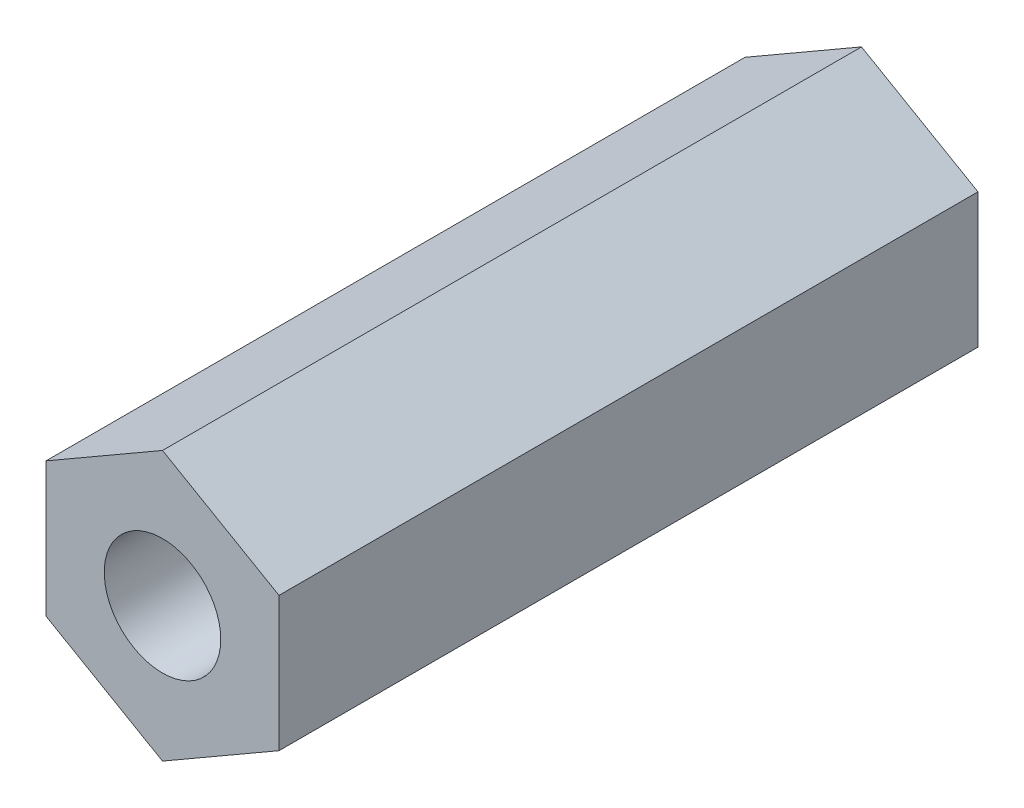
ISO-10303-21;
HEADER;
FILE_DESCRIPTION(('STEP AP214'),'2;1');
FILE_NAME('part.step','',(''),(''),'','','');
FILE_SCHEMA(('AUTOMOTIVE_DESIGN { 1 0 10303 214 1 1 1 1 }'));
ENDSEC;
DATA;
#1=APPLICATION_CONTEXT('core data for automotive mechanical design processes');
#2=APPLICATION_PROTOCOL_DEFINITION('international standard','automotive_design',2000,#1);
#3=PRODUCT_CONTEXT('',#1,'mechanical');
#4=PRODUCT('Part','Part','',(#3));
#5=PRODUCT_RELATED_PRODUCT_CATEGORY('part','',(#4));
#6=PRODUCT_DEFINITION_FORMATION('','',#4);
#7=PRODUCT_DEFINITION_CONTEXT('part definition',#1,'design');
#8=PRODUCT_DEFINITION('design','',#6,#7);
#9=PRODUCT_DEFINITION_SHAPE('','',#8);
#10=(LENGTH_UNIT() NAMED_UNIT(*) SI_UNIT(.MILLI.,.METRE.));
#11=(NAMED_UNIT(*) PLANE_ANGLE_UNIT() SI_UNIT($,.RADIAN.));
#12=(NAMED_UNIT(*) SI_UNIT($,.STERADIAN.) SOLID_ANGLE_UNIT());
#13=UNCERTAINTY_MEASURE_WITH_UNIT(LENGTH_MEASURE(1.E-05),#10,'distance_accuracy_value','');
#14=(GEOMETRIC_REPRESENTATION_CONTEXT(3) GLOBAL_UNCERTAINTY_ASSIGNED_CONTEXT((#13)) GLOBAL_UNIT_ASSIGNED_CONTEXT((#10,
#11,#12)) REPRESENTATION_CONTEXT('',''));
#15=CARTESIAN_POINT('',(0.,0.,0.));
#16=DIRECTION('',(0.,0.,1.));
#17=DIRECTION('',(1.,0.,0.));
#18=AXIS2_PLACEMENT_3D('',#15,#16,#17);
#19=CARTESIAN_POINT('',(0.,3.46410161513775,9.));
#20=DIRECTION('',(0.,0.,1.));
#21=DIRECTION('',(1.,0.,0.));
#22=AXIS2_PLACEMENT_3D('',#19,#20,#21);
#23=PLANE('',#22);
#24=DIRECTION('',(-0.866025403784439,0.499999999999999,0.));
#25=VECTOR('',#24,1.);
#26=CARTESIAN_POINT('',(3.,1.73205080756888,9.));
#27=LINE('',#26,#25);
#28=CARTESIAN_POINT('',(3.,1.73205080756888,9.));
#29=VERTEX_POINT('',#28);
#30=CARTESIAN_POINT('',(0.,3.46410161513775,9.));
#31=VERTEX_POINT('',#30);
#32=EDGE_CURVE('E125',#29,#31,#27,.T.);
#33=ORIENTED_EDGE('',*,*,#32,.T.);
#34=DIRECTION('',(-0.866025403784439,-0.5,0.));
#35=VECTOR('',#34,1.);
#36=CARTESIAN_POINT('',(0.,3.46410161513775,9.));
#37=LINE('',#36,#35);
#38=CARTESIAN_POINT('',(-3.,1.73205080756888,9.));
#39=VERTEX_POINT('',#38);
#40=EDGE_CURVE('E92',#31,#39,#37,.T.);
#41=ORIENTED_EDGE('',*,*,#40,.T.);
#42=DIRECTION('',(0.,-1.,0.));
#43=VECTOR('',#42,1.);
#44=CARTESIAN_POINT('',(-3.,1.73205080756888,9.));
#45=LINE('',#44,#43);
#46=CARTESIAN_POINT('',(-3.,-1.73205080756888,9.));
#47=VERTEX_POINT('',#46);
#48=EDGE_CURVE('E128',#39,#47,#45,.T.);
#49=ORIENTED_EDGE('',*,*,#48,.T.);
#50=DIRECTION('',(0.866025403784439,-0.499999999999999,0.));
#51=VECTOR('',#50,1.);
#52=CARTESIAN_POINT('',(-3.,-1.73205080756888,9.));
#53=LINE('',#52,#51);
#54=CARTESIAN_POINT('',(0.,-3.46410161513775,9.));
#55=VERTEX_POINT('',#54);
#56=EDGE_CURVE('E130',#47,#55,#53,.T.);
#57=ORIENTED_EDGE('',*,*,#56,.T.);
#58=DIRECTION('',(0.866025403784438,0.5,0.));
#59=VECTOR('',#58,1.);
#60=CARTESIAN_POINT('',(0.,-3.46410161513775,9.));
#61=LINE('',#60,#59);
#62=CARTESIAN_POINT('',(3.,-1.73205080756888,9.));
#63=VERTEX_POINT('',#62);
#64=EDGE_CURVE('E56',#55,#63,#61,.T.);
#65=ORIENTED_EDGE('',*,*,#64,.T.);
#66=DIRECTION('',(0.,1.,0.));
#67=VECTOR('',#66,1.);
#68=CARTESIAN_POINT('',(3.,-1.73205080756888,9.));
#69=LINE('',#68,#67);
#70=EDGE_CURVE('E51',#63,#29,#69,.T.);
#71=ORIENTED_EDGE('',*,*,#70,.T.);
#72=EDGE_LOOP('',(#33,#41,#49,#57,#65,#71));
#73=FACE_BOUND('',#72,.T.);
#74=CARTESIAN_POINT('',(0.,0.,9.));
#75=DIRECTION('',(0.,0.,1.));
#76=DIRECTION('',(1.,0.,0.));
#77=AXIS2_PLACEMENT_3D('',#74,#75,#76);
#78=CIRCLE('',#77,1.5);
#79=CARTESIAN_POINT('',(1.5,0.,9.));
#80=VERTEX_POINT('',#79);
#81=EDGE_CURVE('E122',#80,#80,#78,.T.);
#82=ORIENTED_EDGE('',*,*,#81,.F.);
#83=EDGE_LOOP('',(#82));
#84=FACE_BOUND('',#83,.T.);
#85=ADVANCED_FACE('F36',(#73,#84),#23,.T.);
#86=CARTESIAN_POINT('',(3.,1.73205080756888,9.));
#87=DIRECTION('',(-0.499999999999999,-0.866025403784439,0.));
#88=DIRECTION('',(0.866025403784439,-0.499999999999999,0.));
#89=AXIS2_PLACEMENT_3D('',#86,#87,#88);
#90=PLANE('',#89);
#91=DIRECTION('',(0.,0.,-1.));
#92=VECTOR('',#91,1.);
#93=CARTESIAN_POINT('',(3.,1.73205080756888,9.));
#94=LINE('',#93,#92);
#95=CARTESIAN_POINT('',(3.,1.73205080756888,-9.));
#96=VERTEX_POINT('',#95);
#97=EDGE_CURVE('E107',#29,#96,#94,.T.);
#98=ORIENTED_EDGE('',*,*,#97,.T.);
#99=DIRECTION('',(-0.866025403784439,0.499999999999999,0.));
#100=VECTOR('',#99,1.);
#101=CARTESIAN_POINT('',(3.,1.73205080756888,-9.));
#102=LINE('',#101,#100);
#103=CARTESIAN_POINT('',(0.,3.46410161513775,-9.));
#104=VERTEX_POINT('',#103);
#105=EDGE_CURVE('E101',#96,#104,#102,.T.);
#106=ORIENTED_EDGE('',*,*,#105,.T.);
#107=DIRECTION('',(0.,0.,-1.));
#108=VECTOR('',#107,1.);
#109=CARTESIAN_POINT('',(0.,3.46410161513775,9.));
#110=LINE('',#109,#108);
#111=EDGE_CURVE('E11',#31,#104,#110,.T.);
#112=ORIENTED_EDGE('',*,*,#111,.F.);
#113=ORIENTED_EDGE('',*,*,#32,.F.);
#114=EDGE_LOOP('',(#98,#106,#112,#113));
#115=FACE_BOUND('',#114,.T.);
#116=ADVANCED_FACE('F38',(#115),#90,.F.);
#117=CARTESIAN_POINT('',(0.,3.46410161513775,9.));
#118=DIRECTION('',(0.5,-0.866025403784438,0.));
#119=DIRECTION('',(0.866025403784439,0.5,0.));
#120=AXIS2_PLACEMENT_3D('',#117,#118,#119);
#121=PLANE('',#120);
#122=ORIENTED_EDGE('',*,*,#111,.T.);
#123=DIRECTION('',(-0.866025403784439,-0.5,0.));
#124=VECTOR('',#123,1.);
#125=CARTESIAN_POINT('',(0.,3.46410161513775,-9.));
#126=LINE('',#125,#124);
#127=CARTESIAN_POINT('',(-3.,1.73205080756888,-9.));
#128=VERTEX_POINT('',#127);
#129=EDGE_CURVE('E91',#104,#128,#126,.T.);
#130=ORIENTED_EDGE('',*,*,#129,.T.);
#131=DIRECTION('',(0.,0.,-1.));
#132=VECTOR('',#131,1.);
#133=CARTESIAN_POINT('',(-3.,1.73205080756888,9.));
#134=LINE('',#133,#132);
#135=EDGE_CURVE('E44',#39,#128,#134,.T.);
#136=ORIENTED_EDGE('',*,*,#135,.F.);
#137=ORIENTED_EDGE('',*,*,#40,.F.);
#138=EDGE_LOOP('',(#122,#130,#136,#137));
#139=FACE_BOUND('',#138,.T.);
#140=ADVANCED_FACE('F89',(#139),#121,.F.);
#141=CARTESIAN_POINT('',(-3.,1.73205080756888,9.));
#142=DIRECTION('',(1.,0.,0.));
#143=DIRECTION('',(0.,0.,-1.));
#144=AXIS2_PLACEMENT_3D('',#141,#142,#143);
#145=PLANE('',#144);
#146=ORIENTED_EDGE('',*,*,#135,.T.);
#147=DIRECTION('',(0.,-1.,0.));
#148=VECTOR('',#147,1.);
#149=CARTESIAN_POINT('',(-3.,1.73205080756888,-9.));
#150=LINE('',#149,#148);
#151=CARTESIAN_POINT('',(-3.,-1.73205080756888,-9.));
#152=VERTEX_POINT('',#151);
#153=EDGE_CURVE('E105',#128,#152,#150,.T.);
#154=ORIENTED_EDGE('',*,*,#153,.T.);
#155=DIRECTION('',(0.,0.,-1.));
#156=VECTOR('',#155,1.);
#157=CARTESIAN_POINT('',(-3.,-1.73205080756888,9.));
#158=LINE('',#157,#156);
#159=EDGE_CURVE('E139',#47,#152,#158,.T.);
#160=ORIENTED_EDGE('',*,*,#159,.F.);
#161=ORIENTED_EDGE('',*,*,#48,.F.);
#162=EDGE_LOOP('',(#146,#154,#160,#161));
#163=FACE_BOUND('',#162,.T.);
#164=ADVANCED_FACE('F142',(#163),#145,.F.);
#165=CARTESIAN_POINT('',(-3.,-1.73205080756888,9.));
#166=DIRECTION('',(0.499999999999999,0.866025403784439,0.));
#167=DIRECTION('',(-0.866025403784439,0.5,0.));
#168=AXIS2_PLACEMENT_3D('',#165,#166,#167);
#169=PLANE('',#168);
#170=ORIENTED_EDGE('',*,*,#159,.T.);
#171=DIRECTION('',(0.866025403784439,-0.499999999999999,0.));
#172=VECTOR('',#171,1.);
#173=CARTESIAN_POINT('',(-3.,-1.73205080756888,-9.));
#174=LINE('',#173,#172);
#175=CARTESIAN_POINT('',(0.,-3.46410161513775,-9.));
#176=VERTEX_POINT('',#175);
#177=EDGE_CURVE('E114',#152,#176,#174,.T.);
#178=ORIENTED_EDGE('',*,*,#177,.T.);
#179=DIRECTION('',(0.,0.,-1.));
#180=VECTOR('',#179,1.);
#181=CARTESIAN_POINT('',(0.,-3.46410161513775,9.));
#182=LINE('',#181,#180);
#183=EDGE_CURVE('E137',#55,#176,#182,.T.);
#184=ORIENTED_EDGE('',*,*,#183,.F.);
#185=ORIENTED_EDGE('',*,*,#56,.F.);
#186=EDGE_LOOP('',(#170,#178,#184,#185));
#187=FACE_BOUND('',#186,.T.);
#188=ADVANCED_FACE('F148',(#187),#169,.F.);
#189=CARTESIAN_POINT('',(0.,-3.46410161513775,9.));
#190=DIRECTION('',(-0.5,0.866025403784438,0.));
#191=DIRECTION('',(-0.866025403784439,-0.5,0.));
#192=AXIS2_PLACEMENT_3D('',#189,#190,#191);
#193=PLANE('',#192);
#194=ORIENTED_EDGE('',*,*,#183,.T.);
#195=DIRECTION('',(0.866025403784438,0.5,0.));
#196=VECTOR('',#195,1.);
#197=CARTESIAN_POINT('',(0.,-3.46410161513775,-9.));
#198=LINE('',#197,#196);
#199=CARTESIAN_POINT('',(3.,-1.73205080756888,-9.));
#200=VERTEX_POINT('',#199);
#201=EDGE_CURVE('E117',#176,#200,#198,.T.);
#202=ORIENTED_EDGE('',*,*,#201,.T.);
#203=DIRECTION('',(0.,0.,-1.));
#204=VECTOR('',#203,1.);
#205=CARTESIAN_POINT('',(3.,-1.73205080756888,9.));
#206=LINE('',#205,#204);
#207=EDGE_CURVE('E135',#63,#200,#206,.T.);
#208=ORIENTED_EDGE('',*,*,#207,.F.);
#209=ORIENTED_EDGE('',*,*,#64,.F.);
#210=EDGE_LOOP('',(#194,#202,#208,#209));
#211=FACE_BOUND('',#210,.T.);
#212=ADVANCED_FACE('F151',(#211),#193,.F.);
#213=CARTESIAN_POINT('',(3.,-1.73205080756888,9.));
#214=DIRECTION('',(-1.,0.,0.));
#215=DIRECTION('',(0.,-1.,0.));
#216=AXIS2_PLACEMENT_3D('',#213,#214,#215);
#217=PLANE('',#216);
#218=ORIENTED_EDGE('',*,*,#207,.T.);
#219=DIRECTION('',(0.,1.,0.));
#220=VECTOR('',#219,1.);
#221=CARTESIAN_POINT('',(3.,-1.73205080756888,-9.));
#222=LINE('',#221,#220);
#223=EDGE_CURVE('E120',#200,#96,#222,.T.);
#224=ORIENTED_EDGE('',*,*,#223,.T.);
#225=ORIENTED_EDGE('',*,*,#97,.F.);
#226=ORIENTED_EDGE('',*,*,#70,.F.);
#227=EDGE_LOOP('',(#218,#224,#225,#226));
#228=FACE_BOUND('',#227,.T.);
#229=ADVANCED_FACE('F153',(#228),#217,.F.);
#230=CARTESIAN_POINT('',(0.,0.,9.));
#231=DIRECTION('',(0.,0.,-1.));
#232=DIRECTION('',(-1.,0.,0.));
#233=AXIS2_PLACEMENT_3D('',#230,#231,#232);
#234=CYLINDRICAL_SURFACE('',#233,1.5);
#235=ORIENTED_EDGE('',*,*,#81,.T.);
#236=EDGE_LOOP('',(#235));
#237=FACE_BOUND('',#236,.T.);
#238=CARTESIAN_POINT('',(0.,0.,-9.));
#239=DIRECTION('',(0.,0.,1.));
#240=DIRECTION('',(1.,0.,0.));
#241=AXIS2_PLACEMENT_3D('',#238,#239,#240);
#242=CIRCLE('',#241,1.5);
#243=CARTESIAN_POINT('',(1.5,0.,-9.));
#244=VERTEX_POINT('',#243);
#245=EDGE_CURVE('E108',#244,#244,#242,.T.);
#246=ORIENTED_EDGE('',*,*,#245,.F.);
#247=EDGE_LOOP('',(#246));
#248=FACE_BOUND('',#247,.T.);
#249=ADVANCED_FACE('F155',(#237,#248),#234,.F.);
#250=CARTESIAN_POINT('',(0.,3.46410161513775,-9.));
#251=DIRECTION('',(0.,0.,1.));
#252=DIRECTION('',(1.,0.,0.));
#253=AXIS2_PLACEMENT_3D('',#250,#251,#252);
#254=PLANE('',#253);
#255=ORIENTED_EDGE('',*,*,#245,.T.);
#256=EDGE_LOOP('',(#255));
#257=FACE_BOUND('',#256,.T.);
#258=ORIENTED_EDGE('',*,*,#105,.F.);
#259=ORIENTED_EDGE('',*,*,#223,.F.);
#260=ORIENTED_EDGE('',*,*,#201,.F.);
#261=ORIENTED_EDGE('',*,*,#177,.F.);
#262=ORIENTED_EDGE('',*,*,#153,.F.);
#263=ORIENTED_EDGE('',*,*,#129,.F.);
#264=EDGE_LOOP('',(#258,#259,#260,#261,#262,#263));
#265=FACE_BOUND('',#264,.T.);
#266=ADVANCED_FACE('F99',(#257,#265),#254,.F.);
#267=CLOSED_SHELL('',(#85,#116,#140,#164,#188,#212,#229,#249,#266));
#268=MANIFOLD_SOLID_BREP('B2',#267);
#269=ADVANCED_BREP_SHAPE_REPRESENTATION('',(#18,#268),#14);
#270=SHAPE_DEFINITION_REPRESENTATION(#9,#269);
ENDSEC;
END-ISO-10303-21;
